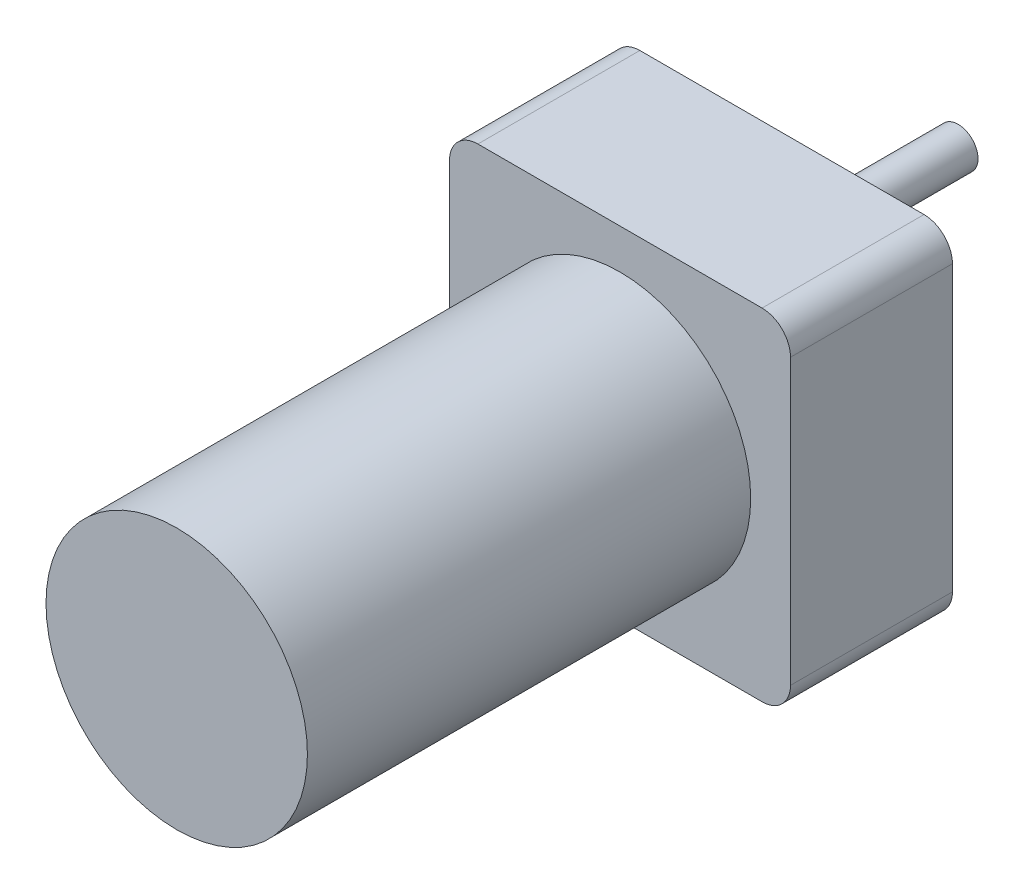
ISO-10303-21;
HEADER;
FILE_DESCRIPTION(('STEP AP214'),'2;1');
FILE_NAME('part.step','',(''),(''),'','','');
FILE_SCHEMA(('AUTOMOTIVE_DESIGN { 1 0 10303 214 1 1 1 1 }'));
ENDSEC;
DATA;
#1=APPLICATION_CONTEXT('core data for automotive mechanical design processes');
#2=APPLICATION_PROTOCOL_DEFINITION('international standard','automotive_design',2000,#1);
#3=PRODUCT_CONTEXT('',#1,'mechanical');
#4=PRODUCT('Part','Part','',(#3));
#5=PRODUCT_RELATED_PRODUCT_CATEGORY('part','',(#4));
#6=PRODUCT_DEFINITION_FORMATION('','',#4);
#7=PRODUCT_DEFINITION_CONTEXT('part definition',#1,'design');
#8=PRODUCT_DEFINITION('design','',#6,#7);
#9=PRODUCT_DEFINITION_SHAPE('','',#8);
#10=(LENGTH_UNIT() NAMED_UNIT(*) SI_UNIT(.MILLI.,.METRE.));
#11=(NAMED_UNIT(*) PLANE_ANGLE_UNIT() SI_UNIT($,.RADIAN.));
#12=(NAMED_UNIT(*) SI_UNIT($,.STERADIAN.) SOLID_ANGLE_UNIT());
#13=UNCERTAINTY_MEASURE_WITH_UNIT(LENGTH_MEASURE(1.E-05),#10,'distance_accuracy_value','');
#14=(GEOMETRIC_REPRESENTATION_CONTEXT(3) GLOBAL_UNCERTAINTY_ASSIGNED_CONTEXT((#13)) GLOBAL_UNIT_ASSIGNED_CONTEXT((#10,
#11,#12)) REPRESENTATION_CONTEXT('',''));
#15=CARTESIAN_POINT('',(0.,0.,0.));
#16=DIRECTION('',(0.,0.,1.));
#17=DIRECTION('',(1.,0.,0.));
#18=AXIS2_PLACEMENT_3D('',#15,#16,#17);
#19=CARTESIAN_POINT('',(4.99999999999998,55.,0.));
#20=DIRECTION('',(0.,0.,-1.));
#21=DIRECTION('',(-1.,0.,0.));
#22=AXIS2_PLACEMENT_3D('',#19,#20,#21);
#23=PLANE('',#22);
#24=CARTESIAN_POINT('',(4.99999999999998,55.,0.));
#25=DIRECTION('',(0.,0.,1.));
#26=DIRECTION('',(-1.,0.,0.));
#27=AXIS2_PLACEMENT_3D('',#24,#25,#26);
#28=CIRCLE('',#27,5.);
#29=CARTESIAN_POINT('',(5.00000000000002,60.,0.));
#30=VERTEX_POINT('',#29);
#31=CARTESIAN_POINT('',(0.,55.,0.));
#32=VERTEX_POINT('',#31);
#33=EDGE_CURVE('E145',#30,#32,#28,.T.);
#34=ORIENTED_EDGE('',*,*,#33,.F.);
#35=DIRECTION('',(-1.,0.,0.));
#36=VECTOR('',#35,1.);
#37=CARTESIAN_POINT('',(5.00000000000002,60.,0.));
#38=LINE('',#37,#36);
#39=CARTESIAN_POINT('',(54.9999999999999,60.,0.));
#40=VERTEX_POINT('',#39);
#41=EDGE_CURVE('E92',#40,#30,#38,.T.);
#42=ORIENTED_EDGE('',*,*,#41,.F.);
#43=CARTESIAN_POINT('',(55.,55.,0.));
#44=DIRECTION('',(0.,0.,1.));
#45=DIRECTION('',(1.,0.,0.));
#46=AXIS2_PLACEMENT_3D('',#43,#44,#45);
#47=CIRCLE('',#46,5.);
#48=CARTESIAN_POINT('',(60.,55.,0.));
#49=VERTEX_POINT('',#48);
#50=EDGE_CURVE('E158',#49,#40,#47,.T.);
#51=ORIENTED_EDGE('',*,*,#50,.F.);
#52=DIRECTION('',(0.,1.,0.));
#53=VECTOR('',#52,1.);
#54=CARTESIAN_POINT('',(60.,5.00000000000004,0.));
#55=LINE('',#54,#53);
#56=CARTESIAN_POINT('',(60.,5.,0.));
#57=VERTEX_POINT('',#56);
#58=EDGE_CURVE('E133',#57,#49,#55,.T.);
#59=ORIENTED_EDGE('',*,*,#58,.F.);
#60=CARTESIAN_POINT('',(55.,5.,0.));
#61=DIRECTION('',(0.,0.,1.));
#62=DIRECTION('',(1.,0.,0.));
#63=AXIS2_PLACEMENT_3D('',#60,#61,#62);
#64=CIRCLE('',#63,5.);
#65=CARTESIAN_POINT('',(55.,0.,0.));
#66=VERTEX_POINT('',#65);
#67=EDGE_CURVE('E155',#66,#57,#64,.T.);
#68=ORIENTED_EDGE('',*,*,#67,.F.);
#69=DIRECTION('',(1.,0.,0.));
#70=VECTOR('',#69,1.);
#71=CARTESIAN_POINT('',(5.00000000000004,0.,0.));
#72=LINE('',#71,#70);
#73=CARTESIAN_POINT('',(5.00000000000003,0.,0.));
#74=VERTEX_POINT('',#73);
#75=EDGE_CURVE('E153',#74,#66,#72,.T.);
#76=ORIENTED_EDGE('',*,*,#75,.F.);
#77=CARTESIAN_POINT('',(5.,5.,0.));
#78=DIRECTION('',(0.,0.,1.));
#79=DIRECTION('',(1.,0.,0.));
#80=AXIS2_PLACEMENT_3D('',#77,#78,#79);
#81=CIRCLE('',#80,5.);
#82=CARTESIAN_POINT('',(0.,5.00000000000003,0.));
#83=VERTEX_POINT('',#82);
#84=EDGE_CURVE('E151',#83,#74,#81,.T.);
#85=ORIENTED_EDGE('',*,*,#84,.F.);
#86=DIRECTION('',(0.,-1.,0.));
#87=VECTOR('',#86,1.);
#88=CARTESIAN_POINT('',(0.,5.00000000000003,0.));
#89=LINE('',#88,#87);
#90=EDGE_CURVE('E148',#32,#83,#89,.T.);
#91=ORIENTED_EDGE('',*,*,#90,.F.);
#92=EDGE_LOOP('',(#34,#42,#51,#59,#68,#76,#85,#91));
#93=FACE_BOUND('',#92,.T.);
#94=CARTESIAN_POINT('',(54.75,54.75,0.));
#95=DIRECTION('',(0.,0.,-1.));
#96=DIRECTION('',(-1.,0.,0.));
#97=AXIS2_PLACEMENT_3D('',#94,#95,#96);
#98=CIRCLE('',#97,2.4);
#99=CARTESIAN_POINT('',(52.35,54.75,0.));
#100=VERTEX_POINT('',#99);
#101=EDGE_CURVE('E489',#100,#100,#98,.T.);
#102=ORIENTED_EDGE('',*,*,#101,.F.);
#103=EDGE_LOOP('',(#102));
#104=FACE_BOUND('',#103,.T.);
#105=CARTESIAN_POINT('',(5.24999999999998,54.75,0.));
#106=DIRECTION('',(0.,0.,-1.));
#107=DIRECTION('',(-1.,0.,0.));
#108=AXIS2_PLACEMENT_3D('',#105,#106,#107);
#109=CIRCLE('',#108,2.4);
#110=CARTESIAN_POINT('',(2.84999999999998,54.75,0.));
#111=VERTEX_POINT('',#110);
#112=EDGE_CURVE('E508',#111,#111,#109,.T.);
#113=ORIENTED_EDGE('',*,*,#112,.F.);
#114=EDGE_LOOP('',(#113));
#115=FACE_BOUND('',#114,.T.);
#116=CARTESIAN_POINT('',(5.25,5.25,0.));
#117=DIRECTION('',(0.,0.,-1.));
#118=DIRECTION('',(-1.,0.,0.));
#119=AXIS2_PLACEMENT_3D('',#116,#117,#118);
#120=CIRCLE('',#119,2.4);
#121=CARTESIAN_POINT('',(2.85,5.25,0.));
#122=VERTEX_POINT('',#121);
#123=EDGE_CURVE('E502',#122,#122,#120,.T.);
#124=ORIENTED_EDGE('',*,*,#123,.F.);
#125=EDGE_LOOP('',(#124));
#126=FACE_BOUND('',#125,.T.);
#127=CARTESIAN_POINT('',(54.75,5.24999999999999,0.));
#128=DIRECTION('',(0.,0.,-1.));
#129=DIRECTION('',(-1.,0.,0.));
#130=AXIS2_PLACEMENT_3D('',#127,#128,#129);
#131=CIRCLE('',#130,2.4);
#132=CARTESIAN_POINT('',(52.35,5.24999999999999,0.));
#133=VERTEX_POINT('',#132);
#134=EDGE_CURVE('E495',#133,#133,#131,.T.);
#135=ORIENTED_EDGE('',*,*,#134,.F.);
#136=EDGE_LOOP('',(#135));
#137=FACE_BOUND('',#136,.T.);
#138=CARTESIAN_POINT('',(30.,40.,0.));
#139=DIRECTION('',(0.,0.,-1.));
#140=DIRECTION('',(-1.,0.,0.));
#141=AXIS2_PLACEMENT_3D('',#138,#139,#140);
#142=CIRCLE('',#141,12.5);
#143=CARTESIAN_POINT('',(17.5,40.,0.));
#144=VERTEX_POINT('',#143);
#145=EDGE_CURVE('E513',#144,#144,#142,.T.);
#146=ORIENTED_EDGE('',*,*,#145,.F.);
#147=EDGE_LOOP('',(#146));
#148=FACE_BOUND('',#147,.T.);
#149=ADVANCED_FACE('F33',(#93,#104,#115,#126,#137,#148),#23,.T.);
#150=CARTESIAN_POINT('',(4.99999999999998,55.,28.5));
#151=DIRECTION('',(0.,0.,-1.));
#152=DIRECTION('',(-1.,0.,0.));
#153=AXIS2_PLACEMENT_3D('',#150,#151,#152);
#154=CYLINDRICAL_SURFACE('',#153,5.);
#155=ORIENTED_EDGE('',*,*,#33,.T.);
#156=DIRECTION('',(0.,0.,-1.));
#157=VECTOR('',#156,1.);
#158=CARTESIAN_POINT('',(0.,55.,28.5));
#159=LINE('',#158,#157);
#160=CARTESIAN_POINT('',(0.,55.,28.5));
#161=VERTEX_POINT('',#160);
#162=EDGE_CURVE('E37',#161,#32,#159,.T.);
#163=ORIENTED_EDGE('',*,*,#162,.F.);
#164=CARTESIAN_POINT('',(4.99999999999998,55.,28.5));
#165=DIRECTION('',(0.,0.,1.));
#166=DIRECTION('',(-1.,0.,0.));
#167=AXIS2_PLACEMENT_3D('',#164,#165,#166);
#168=CIRCLE('',#167,5.);
#169=CARTESIAN_POINT('',(5.00000000000002,60.,28.5));
#170=VERTEX_POINT('',#169);
#171=EDGE_CURVE('E161',#170,#161,#168,.T.);
#172=ORIENTED_EDGE('',*,*,#171,.F.);
#173=DIRECTION('',(0.,0.,-1.));
#174=VECTOR('',#173,1.);
#175=CARTESIAN_POINT('',(5.00000000000002,60.,28.5));
#176=LINE('',#175,#174);
#177=EDGE_CURVE('E141',#170,#30,#176,.T.);
#178=ORIENTED_EDGE('',*,*,#177,.T.);
#179=EDGE_LOOP('',(#155,#163,#172,#178));
#180=FACE_BOUND('',#179,.T.);
#181=ADVANCED_FACE('F35',(#180),#154,.T.);
#182=CARTESIAN_POINT('',(0.,5.00000000000003,28.5));
#183=DIRECTION('',(1.,0.,0.));
#184=DIRECTION('',(0.,1.,0.));
#185=AXIS2_PLACEMENT_3D('',#182,#183,#184);
#186=PLANE('',#185);
#187=ORIENTED_EDGE('',*,*,#90,.T.);
#188=DIRECTION('',(0.,0.,-1.));
#189=VECTOR('',#188,1.);
#190=CARTESIAN_POINT('',(0.,5.00000000000003,28.5));
#191=LINE('',#190,#189);
#192=CARTESIAN_POINT('',(0.,5.00000000000003,28.5));
#193=VERTEX_POINT('',#192);
#194=EDGE_CURVE('E170',#193,#83,#191,.T.);
#195=ORIENTED_EDGE('',*,*,#194,.F.);
#196=DIRECTION('',(0.,-1.,0.));
#197=VECTOR('',#196,1.);
#198=CARTESIAN_POINT('',(0.,5.00000000000003,28.5));
#199=LINE('',#198,#197);
#200=EDGE_CURVE('E101',#161,#193,#199,.T.);
#201=ORIENTED_EDGE('',*,*,#200,.F.);
#202=ORIENTED_EDGE('',*,*,#162,.T.);
#203=EDGE_LOOP('',(#187,#195,#201,#202));
#204=FACE_BOUND('',#203,.T.);
#205=ADVANCED_FACE('F203',(#204),#186,.F.);
#206=CARTESIAN_POINT('',(5.,5.,28.5));
#207=DIRECTION('',(0.,0.,-1.));
#208=DIRECTION('',(-1.,0.,0.));
#209=AXIS2_PLACEMENT_3D('',#206,#207,#208);
#210=CYLINDRICAL_SURFACE('',#209,5.);
#211=ORIENTED_EDGE('',*,*,#84,.T.);
#212=DIRECTION('',(0.,0.,-1.));
#213=VECTOR('',#212,1.);
#214=CARTESIAN_POINT('',(5.00000000000003,0.,28.5));
#215=LINE('',#214,#213);
#216=CARTESIAN_POINT('',(5.00000000000003,0.,28.5));
#217=VERTEX_POINT('',#216);
#218=EDGE_CURVE('E168',#217,#74,#215,.T.);
#219=ORIENTED_EDGE('',*,*,#218,.F.);
#220=CARTESIAN_POINT('',(5.,5.,28.5));
#221=DIRECTION('',(0.,0.,1.));
#222=DIRECTION('',(1.,0.,0.));
#223=AXIS2_PLACEMENT_3D('',#220,#221,#222);
#224=CIRCLE('',#223,5.);
#225=EDGE_CURVE('E185',#193,#217,#224,.T.);
#226=ORIENTED_EDGE('',*,*,#225,.F.);
#227=ORIENTED_EDGE('',*,*,#194,.T.);
#228=EDGE_LOOP('',(#211,#219,#226,#227));
#229=FACE_BOUND('',#228,.T.);
#230=ADVANCED_FACE('F204',(#229),#210,.T.);
#231=CARTESIAN_POINT('',(5.00000000000004,0.,28.5));
#232=DIRECTION('',(0.,1.,0.));
#233=DIRECTION('',(0.,0.,1.));
#234=AXIS2_PLACEMENT_3D('',#231,#232,#233);
#235=PLANE('',#234);
#236=ORIENTED_EDGE('',*,*,#75,.T.);
#237=DIRECTION('',(0.,0.,-1.));
#238=VECTOR('',#237,1.);
#239=CARTESIAN_POINT('',(55.,0.,28.5));
#240=LINE('',#239,#238);
#241=CARTESIAN_POINT('',(55.,0.,28.5));
#242=VERTEX_POINT('',#241);
#243=EDGE_CURVE('E165',#242,#66,#240,.T.);
#244=ORIENTED_EDGE('',*,*,#243,.F.);
#245=DIRECTION('',(1.,0.,0.));
#246=VECTOR('',#245,1.);
#247=CARTESIAN_POINT('',(5.00000000000004,0.,28.5));
#248=LINE('',#247,#246);
#249=EDGE_CURVE('E187',#217,#242,#248,.T.);
#250=ORIENTED_EDGE('',*,*,#249,.F.);
#251=ORIENTED_EDGE('',*,*,#218,.T.);
#252=EDGE_LOOP('',(#236,#244,#250,#251));
#253=FACE_BOUND('',#252,.T.);
#254=ADVANCED_FACE('F192',(#253),#235,.F.);
#255=CARTESIAN_POINT('',(55.,5.,28.5));
#256=DIRECTION('',(0.,0.,-1.));
#257=DIRECTION('',(-1.,0.,0.));
#258=AXIS2_PLACEMENT_3D('',#255,#256,#257);
#259=CYLINDRICAL_SURFACE('',#258,5.);
#260=ORIENTED_EDGE('',*,*,#67,.T.);
#261=DIRECTION('',(0.,0.,-1.));
#262=VECTOR('',#261,1.);
#263=CARTESIAN_POINT('',(60.,5.,28.5));
#264=LINE('',#263,#262);
#265=CARTESIAN_POINT('',(60.,5.,28.5));
#266=VERTEX_POINT('',#265);
#267=EDGE_CURVE('E136',#266,#57,#264,.T.);
#268=ORIENTED_EDGE('',*,*,#267,.F.);
#269=CARTESIAN_POINT('',(55.,5.,28.5));
#270=DIRECTION('',(0.,0.,1.));
#271=DIRECTION('',(1.,0.,0.));
#272=AXIS2_PLACEMENT_3D('',#269,#270,#271);
#273=CIRCLE('',#272,5.);
#274=EDGE_CURVE('E124',#242,#266,#273,.T.);
#275=ORIENTED_EDGE('',*,*,#274,.F.);
#276=ORIENTED_EDGE('',*,*,#243,.T.);
#277=EDGE_LOOP('',(#260,#268,#275,#276));
#278=FACE_BOUND('',#277,.T.);
#279=ADVANCED_FACE('F196',(#278),#259,.T.);
#280=CARTESIAN_POINT('',(60.,5.00000000000004,28.5));
#281=DIRECTION('',(-1.,0.,0.));
#282=DIRECTION('',(0.,-1.,0.));
#283=AXIS2_PLACEMENT_3D('',#280,#281,#282);
#284=PLANE('',#283);
#285=ORIENTED_EDGE('',*,*,#58,.T.);
#286=DIRECTION('',(0.,0.,-1.));
#287=VECTOR('',#286,1.);
#288=CARTESIAN_POINT('',(60.,55.,28.5));
#289=LINE('',#288,#287);
#290=CARTESIAN_POINT('',(60.,55.,28.5));
#291=VERTEX_POINT('',#290);
#292=EDGE_CURVE('E130',#291,#49,#289,.T.);
#293=ORIENTED_EDGE('',*,*,#292,.F.);
#294=DIRECTION('',(0.,1.,0.));
#295=VECTOR('',#294,1.);
#296=CARTESIAN_POINT('',(60.,5.00000000000004,28.5));
#297=LINE('',#296,#295);
#298=EDGE_CURVE('E117',#266,#291,#297,.T.);
#299=ORIENTED_EDGE('',*,*,#298,.F.);
#300=ORIENTED_EDGE('',*,*,#267,.T.);
#301=EDGE_LOOP('',(#285,#293,#299,#300));
#302=FACE_BOUND('',#301,.T.);
#303=ADVANCED_FACE('F131',(#302),#284,.F.);
#304=CARTESIAN_POINT('',(55.,55.,28.5));
#305=DIRECTION('',(0.,0.,-1.));
#306=DIRECTION('',(-1.,0.,0.));
#307=AXIS2_PLACEMENT_3D('',#304,#305,#306);
#308=CYLINDRICAL_SURFACE('',#307,5.);
#309=ORIENTED_EDGE('',*,*,#50,.T.);
#310=DIRECTION('',(0.,0.,-1.));
#311=VECTOR('',#310,1.);
#312=CARTESIAN_POINT('',(54.9999999999999,60.,28.5));
#313=LINE('',#312,#311);
#314=CARTESIAN_POINT('',(54.9999999999999,60.,28.5));
#315=VERTEX_POINT('',#314);
#316=EDGE_CURVE('E137',#315,#40,#313,.T.);
#317=ORIENTED_EDGE('',*,*,#316,.F.);
#318=CARTESIAN_POINT('',(55.,55.,28.5));
#319=DIRECTION('',(0.,0.,1.));
#320=DIRECTION('',(1.,0.,0.));
#321=AXIS2_PLACEMENT_3D('',#318,#319,#320);
#322=CIRCLE('',#321,5.);
#323=EDGE_CURVE('E121',#291,#315,#322,.T.);
#324=ORIENTED_EDGE('',*,*,#323,.F.);
#325=ORIENTED_EDGE('',*,*,#292,.T.);
#326=EDGE_LOOP('',(#309,#317,#324,#325));
#327=FACE_BOUND('',#326,.T.);
#328=ADVANCED_FACE('F139',(#327),#308,.T.);
#329=CARTESIAN_POINT('',(5.00000000000002,60.,28.5));
#330=DIRECTION('',(0.,-1.,0.));
#331=DIRECTION('',(0.,0.,-1.));
#332=AXIS2_PLACEMENT_3D('',#329,#330,#331);
#333=PLANE('',#332);
#334=ORIENTED_EDGE('',*,*,#41,.T.);
#335=ORIENTED_EDGE('',*,*,#177,.F.);
#336=DIRECTION('',(-1.,0.,0.));
#337=VECTOR('',#336,1.);
#338=CARTESIAN_POINT('',(5.00000000000002,60.,28.5));
#339=LINE('',#338,#337);
#340=EDGE_CURVE('E59',#315,#170,#339,.T.);
#341=ORIENTED_EDGE('',*,*,#340,.F.);
#342=ORIENTED_EDGE('',*,*,#316,.T.);
#343=EDGE_LOOP('',(#334,#335,#341,#342));
#344=FACE_BOUND('',#343,.T.);
#345=ADVANCED_FACE('F200',(#344),#333,.F.);
#346=CARTESIAN_POINT('',(4.99999999999998,55.,28.5));
#347=DIRECTION('',(0.,0.,-1.));
#348=DIRECTION('',(-1.,0.,0.));
#349=AXIS2_PLACEMENT_3D('',#346,#347,#348);
#350=PLANE('',#349);
#351=CARTESIAN_POINT('',(30.,30.,28.5));
#352=DIRECTION('',(0.,0.,1.));
#353=DIRECTION('',(1.,0.,0.));
#354=AXIS2_PLACEMENT_3D('',#351,#352,#353);
#355=CIRCLE('',#354,23.);
#356=CARTESIAN_POINT('',(53.,30.,28.5));
#357=VERTEX_POINT('',#356);
#358=EDGE_CURVE('E42',#357,#357,#355,.T.);
#359=ORIENTED_EDGE('',*,*,#358,.F.);
#360=EDGE_LOOP('',(#359));
#361=FACE_BOUND('',#360,.T.);
#362=ORIENTED_EDGE('',*,*,#171,.T.);
#363=ORIENTED_EDGE('',*,*,#200,.T.);
#364=ORIENTED_EDGE('',*,*,#225,.T.);
#365=ORIENTED_EDGE('',*,*,#249,.T.);
#366=ORIENTED_EDGE('',*,*,#274,.T.);
#367=ORIENTED_EDGE('',*,*,#298,.T.);
#368=ORIENTED_EDGE('',*,*,#323,.T.);
#369=ORIENTED_EDGE('',*,*,#340,.T.);
#370=EDGE_LOOP('',(#362,#363,#364,#365,#366,#367,#368,#369));
#371=FACE_BOUND('',#370,.T.);
#372=ADVANCED_FACE('F119',(#361,#371),#350,.F.);
#373=CARTESIAN_POINT('',(30.,30.,106.5));
#374=DIRECTION('',(0.,0.,-1.));
#375=DIRECTION('',(-1.,0.,0.));
#376=AXIS2_PLACEMENT_3D('',#373,#374,#375);
#377=CYLINDRICAL_SURFACE('',#376,23.);
#378=CARTESIAN_POINT('',(30.,30.,106.5));
#379=DIRECTION('',(0.,0.,1.));
#380=DIRECTION('',(1.,0.,0.));
#381=AXIS2_PLACEMENT_3D('',#378,#379,#380);
#382=CIRCLE('',#381,23.);
#383=CARTESIAN_POINT('',(53.,30.,106.5));
#384=VERTEX_POINT('',#383);
#385=EDGE_CURVE('E149',#384,#384,#382,.T.);
#386=ORIENTED_EDGE('',*,*,#385,.F.);
#387=EDGE_LOOP('',(#386));
#388=FACE_BOUND('',#387,.T.);
#389=ORIENTED_EDGE('',*,*,#358,.T.);
#390=EDGE_LOOP('',(#389));
#391=FACE_BOUND('',#390,.T.);
#392=ADVANCED_FACE('F249',(#388,#391),#377,.T.);
#393=CARTESIAN_POINT('',(30.,30.,106.5));
#394=DIRECTION('',(0.,0.,1.));
#395=DIRECTION('',(1.,0.,0.));
#396=AXIS2_PLACEMENT_3D('',#393,#394,#395);
#397=PLANE('',#396);
#398=ORIENTED_EDGE('',*,*,#385,.T.);
#399=EDGE_LOOP('',(#398));
#400=FACE_BOUND('',#399,.T.);
#401=ADVANCED_FACE('F256',(#400),#397,.T.);
#402=CARTESIAN_POINT('',(54.75,54.75,10.));
#403=DIRECTION('',(0.,0.,-1.));
#404=DIRECTION('',(-1.,0.,0.));
#405=AXIS2_PLACEMENT_3D('',#402,#403,#404);
#406=CYLINDRICAL_SURFACE('',#405,2.4);
#407=CARTESIAN_POINT('',(54.75,54.75,10.));
#408=DIRECTION('',(0.,0.,-1.));
#409=DIRECTION('',(-1.,0.,0.));
#410=AXIS2_PLACEMENT_3D('',#407,#408,#409);
#411=CIRCLE('',#410,2.4);
#412=CARTESIAN_POINT('',(52.35,54.75,10.));
#413=VERTEX_POINT('',#412);
#414=EDGE_CURVE('E484',#413,#413,#411,.T.);
#415=ORIENTED_EDGE('',*,*,#414,.F.);
#416=EDGE_LOOP('',(#415));
#417=FACE_BOUND('',#416,.T.);
#418=ORIENTED_EDGE('',*,*,#101,.T.);
#419=EDGE_LOOP('',(#418));
#420=FACE_BOUND('',#419,.T.);
#421=ADVANCED_FACE('F263',(#417,#420),#406,.F.);
#422=CARTESIAN_POINT('',(54.75,54.75,10.));
#423=DIRECTION('',(0.,0.,-1.));
#424=DIRECTION('',(-1.,0.,0.));
#425=AXIS2_PLACEMENT_3D('',#422,#423,#424);
#426=PLANE('',#425);
#427=ORIENTED_EDGE('',*,*,#414,.T.);
#428=EDGE_LOOP('',(#427));
#429=FACE_BOUND('',#428,.T.);
#430=ADVANCED_FACE('F272',(#429),#426,.T.);
#431=CARTESIAN_POINT('',(5.24999999999998,54.75,10.));
#432=DIRECTION('',(0.,0.,-1.));
#433=DIRECTION('',(-1.,0.,0.));
#434=AXIS2_PLACEMENT_3D('',#431,#432,#433);
#435=CYLINDRICAL_SURFACE('',#434,2.4);
#436=CARTESIAN_POINT('',(5.24999999999998,54.75,10.));
#437=DIRECTION('',(0.,0.,-1.));
#438=DIRECTION('',(-1.,0.,0.));
#439=AXIS2_PLACEMENT_3D('',#436,#437,#438);
#440=CIRCLE('',#439,2.4);
#441=CARTESIAN_POINT('',(2.84999999999998,54.75,10.));
#442=VERTEX_POINT('',#441);
#443=EDGE_CURVE('E492',#442,#442,#440,.T.);
#444=ORIENTED_EDGE('',*,*,#443,.F.);
#445=EDGE_LOOP('',(#444));
#446=FACE_BOUND('',#445,.T.);
#447=ORIENTED_EDGE('',*,*,#112,.T.);
#448=EDGE_LOOP('',(#447));
#449=FACE_BOUND('',#448,.T.);
#450=ADVANCED_FACE('F281',(#446,#449),#435,.F.);
#451=CARTESIAN_POINT('',(5.24999999999998,54.75,10.));
#452=DIRECTION('',(0.,0.,-1.));
#453=DIRECTION('',(-1.,0.,0.));
#454=AXIS2_PLACEMENT_3D('',#451,#452,#453);
#455=PLANE('',#454);
#456=ORIENTED_EDGE('',*,*,#443,.T.);
#457=EDGE_LOOP('',(#456));
#458=FACE_BOUND('',#457,.T.);
#459=ADVANCED_FACE('F289',(#458),#455,.T.);
#460=CARTESIAN_POINT('',(5.25,5.25,10.));
#461=DIRECTION('',(0.,0.,-1.));
#462=DIRECTION('',(-1.,0.,0.));
#463=AXIS2_PLACEMENT_3D('',#460,#461,#462);
#464=CYLINDRICAL_SURFACE('',#463,2.4);
#465=CARTESIAN_POINT('',(5.25,5.25,10.));
#466=DIRECTION('',(0.,0.,-1.));
#467=DIRECTION('',(-1.,0.,0.));
#468=AXIS2_PLACEMENT_3D('',#465,#466,#467);
#469=CIRCLE('',#468,2.4);
#470=CARTESIAN_POINT('',(2.85,5.25,10.));
#471=VERTEX_POINT('',#470);
#472=EDGE_CURVE('E505',#471,#471,#469,.T.);
#473=ORIENTED_EDGE('',*,*,#472,.F.);
#474=EDGE_LOOP('',(#473));
#475=FACE_BOUND('',#474,.T.);
#476=ORIENTED_EDGE('',*,*,#123,.T.);
#477=EDGE_LOOP('',(#476));
#478=FACE_BOUND('',#477,.T.);
#479=ADVANCED_FACE('F297',(#475,#478),#464,.F.);
#480=CARTESIAN_POINT('',(5.25,5.25,10.));
#481=DIRECTION('',(0.,0.,-1.));
#482=DIRECTION('',(-1.,0.,0.));
#483=AXIS2_PLACEMENT_3D('',#480,#481,#482);
#484=PLANE('',#483);
#485=ORIENTED_EDGE('',*,*,#472,.T.);
#486=EDGE_LOOP('',(#485));
#487=FACE_BOUND('',#486,.T.);
#488=ADVANCED_FACE('F305',(#487),#484,.T.);
#489=CARTESIAN_POINT('',(54.75,5.24999999999999,10.));
#490=DIRECTION('',(0.,0.,-1.));
#491=DIRECTION('',(-1.,0.,0.));
#492=AXIS2_PLACEMENT_3D('',#489,#490,#491);
#493=CYLINDRICAL_SURFACE('',#492,2.4);
#494=CARTESIAN_POINT('',(54.75,5.24999999999999,10.));
#495=DIRECTION('',(0.,0.,-1.));
#496=DIRECTION('',(-1.,0.,0.));
#497=AXIS2_PLACEMENT_3D('',#494,#495,#496);
#498=CIRCLE('',#497,2.4);
#499=CARTESIAN_POINT('',(52.35,5.24999999999999,10.));
#500=VERTEX_POINT('',#499);
#501=EDGE_CURVE('E498',#500,#500,#498,.T.);
#502=ORIENTED_EDGE('',*,*,#501,.F.);
#503=EDGE_LOOP('',(#502));
#504=FACE_BOUND('',#503,.T.);
#505=ORIENTED_EDGE('',*,*,#134,.T.);
#506=EDGE_LOOP('',(#505));
#507=FACE_BOUND('',#506,.T.);
#508=ADVANCED_FACE('F313',(#504,#507),#493,.F.);
#509=CARTESIAN_POINT('',(54.75,5.24999999999999,10.));
#510=DIRECTION('',(0.,0.,-1.));
#511=DIRECTION('',(-1.,0.,0.));
#512=AXIS2_PLACEMENT_3D('',#509,#510,#511);
#513=PLANE('',#512);
#514=ORIENTED_EDGE('',*,*,#501,.T.);
#515=EDGE_LOOP('',(#514));
#516=FACE_BOUND('',#515,.T.);
#517=ADVANCED_FACE('F321',(#516),#513,.T.);
#518=CARTESIAN_POINT('',(30.,40.,-3.));
#519=DIRECTION('',(0.,0.,-1.));
#520=DIRECTION('',(-1.,0.,0.));
#521=AXIS2_PLACEMENT_3D('',#518,#519,#520);
#522=PLANE('',#521);
#523=CARTESIAN_POINT('',(30.,40.,-3.));
#524=DIRECTION('',(0.,0.,-1.));
#525=DIRECTION('',(-1.,0.,0.));
#526=AXIS2_PLACEMENT_3D('',#523,#524,#525);
#527=CIRCLE('',#526,12.5);
#528=CARTESIAN_POINT('',(17.5,40.,-3.));
#529=VERTEX_POINT('',#528);
#530=EDGE_CURVE('E499',#529,#529,#527,.T.);
#531=ORIENTED_EDGE('',*,*,#530,.T.);
#532=EDGE_LOOP('',(#531));
#533=FACE_BOUND('',#532,.T.);
#534=CARTESIAN_POINT('',(30.,40.,-3.));
#535=DIRECTION('',(0.,0.,-1.));
#536=DIRECTION('',(-1.,0.,0.));
#537=AXIS2_PLACEMENT_3D('',#534,#535,#536);
#538=CIRCLE('',#537,9.125);
#539=CARTESIAN_POINT('',(20.875,40.,-3.));
#540=VERTEX_POINT('',#539);
#541=EDGE_CURVE('E466',#540,#540,#538,.T.);
#542=ORIENTED_EDGE('',*,*,#541,.F.);
#543=EDGE_LOOP('',(#542));
#544=FACE_BOUND('',#543,.T.);
#545=ADVANCED_FACE('F329',(#533,#544),#522,.T.);
#546=CARTESIAN_POINT('',(30.,40.,-3.));
#547=DIRECTION('',(0.,0.,1.));
#548=DIRECTION('',(1.,0.,0.));
#549=AXIS2_PLACEMENT_3D('',#546,#547,#548);
#550=CYLINDRICAL_SURFACE('',#549,12.5);
#551=ORIENTED_EDGE('',*,*,#530,.F.);
#552=EDGE_LOOP('',(#551));
#553=FACE_BOUND('',#552,.T.);
#554=ORIENTED_EDGE('',*,*,#145,.T.);
#555=EDGE_LOOP('',(#554));
#556=FACE_BOUND('',#555,.T.);
#557=ADVANCED_FACE('F337',(#553,#556),#550,.T.);
#558=CARTESIAN_POINT('',(30.,42.25,-13.));
#559=DIRECTION('',(0.,0.,-1.));
#560=DIRECTION('',(-1.,0.,0.));
#561=AXIS2_PLACEMENT_3D('',#558,#559,#560);
#562=PLANE('',#561);
#563=CARTESIAN_POINT('',(30.,42.25,-13.));
#564=DIRECTION('',(0.,0.,-1.));
#565=DIRECTION('',(-1.,0.,0.));
#566=AXIS2_PLACEMENT_3D('',#563,#564,#565);
#567=CIRCLE('',#566,3.5);
#568=CARTESIAN_POINT('',(32.5,39.8005102572168,-13.));
#569=VERTEX_POINT('',#568);
#570=CARTESIAN_POINT('',(27.5,39.8005102572168,-13.));
#571=VERTEX_POINT('',#570);
#572=EDGE_CURVE('E483',#569,#571,#567,.T.);
#573=ORIENTED_EDGE('',*,*,#572,.T.);
#574=DIRECTION('',(1.,0.,0.));
#575=VECTOR('',#574,1.);
#576=CARTESIAN_POINT('',(32.5,39.8005102572168,-13.));
#577=LINE('',#576,#575);
#578=EDGE_CURVE('E478',#571,#569,#577,.T.);
#579=ORIENTED_EDGE('',*,*,#578,.T.);
#580=EDGE_LOOP('',(#573,#579));
#581=FACE_BOUND('',#580,.T.);
#582=ADVANCED_FACE('F345',(#581),#562,.T.);
#583=CARTESIAN_POINT('',(32.5,39.8005102572168,-13.));
#584=DIRECTION('',(0.,1.,0.));
#585=DIRECTION('',(0.,0.,1.));
#586=AXIS2_PLACEMENT_3D('',#583,#584,#585);
#587=PLANE('',#586);
#588=DIRECTION('',(1.,0.,0.));
#589=VECTOR('',#588,1.);
#590=CARTESIAN_POINT('',(32.5,39.8005102572168,-31.));
#591=LINE('',#590,#589);
#592=CARTESIAN_POINT('',(27.5,39.8005102572168,-31.));
#593=VERTEX_POINT('',#592);
#594=CARTESIAN_POINT('',(32.5,39.8005102572168,-31.));
#595=VERTEX_POINT('',#594);
#596=EDGE_CURVE('E481',#593,#595,#591,.T.);
#597=ORIENTED_EDGE('',*,*,#596,.T.);
#598=DIRECTION('',(0.,0.,-1.));
#599=VECTOR('',#598,1.);
#600=CARTESIAN_POINT('',(32.5,39.8005102572168,-13.));
#601=LINE('',#600,#599);
#602=EDGE_CURVE('E474',#569,#595,#601,.T.);
#603=ORIENTED_EDGE('',*,*,#602,.F.);
#604=ORIENTED_EDGE('',*,*,#578,.F.);
#605=DIRECTION('',(0.,0.,-1.));
#606=VECTOR('',#605,1.);
#607=CARTESIAN_POINT('',(27.5,39.8005102572168,-13.));
#608=LINE('',#607,#606);
#609=EDGE_CURVE('E50',#571,#593,#608,.T.);
#610=ORIENTED_EDGE('',*,*,#609,.T.);
#611=EDGE_LOOP('',(#597,#603,#604,#610));
#612=FACE_BOUND('',#611,.T.);
#613=ADVANCED_FACE('F353',(#612),#587,.F.);
#614=CARTESIAN_POINT('',(30.,42.25,-31.));
#615=DIRECTION('',(0.,0.,-1.));
#616=DIRECTION('',(-1.,0.,0.));
#617=AXIS2_PLACEMENT_3D('',#614,#615,#616);
#618=PLANE('',#617);
#619=ORIENTED_EDGE('',*,*,#596,.F.);
#620=CARTESIAN_POINT('',(30.,42.25,-31.));
#621=DIRECTION('',(0.,0.,-1.));
#622=DIRECTION('',(-1.,0.,0.));
#623=AXIS2_PLACEMENT_3D('',#620,#621,#622);
#624=CIRCLE('',#623,3.5);
#625=EDGE_CURVE('E471',#593,#595,#624,.T.);
#626=ORIENTED_EDGE('',*,*,#625,.T.);
#627=EDGE_LOOP('',(#619,#626));
#628=FACE_BOUND('',#627,.T.);
#629=ADVANCED_FACE('F361',(#628),#618,.T.);
#630=CARTESIAN_POINT('',(30.,42.25,-31.));
#631=DIRECTION('',(0.,0.,1.));
#632=DIRECTION('',(1.,0.,0.));
#633=AXIS2_PLACEMENT_3D('',#630,#631,#632);
#634=CYLINDRICAL_SURFACE('',#633,3.5);
#635=ORIENTED_EDGE('',*,*,#625,.F.);
#636=ORIENTED_EDGE('',*,*,#609,.F.);
#637=ORIENTED_EDGE('',*,*,#572,.F.);
#638=ORIENTED_EDGE('',*,*,#602,.T.);
#639=EDGE_LOOP('',(#635,#636,#637,#638));
#640=FACE_BOUND('',#639,.T.);
#641=CARTESIAN_POINT('',(30.,42.25,-6.));
#642=DIRECTION('',(0.,0.,-1.));
#643=DIRECTION('',(-1.,0.,0.));
#644=AXIS2_PLACEMENT_3D('',#641,#642,#643);
#645=CIRCLE('',#644,3.5);
#646=CARTESIAN_POINT('',(26.5,42.25,-6.));
#647=VERTEX_POINT('',#646);
#648=EDGE_CURVE('E11',#647,#647,#645,.T.);
#649=ORIENTED_EDGE('',*,*,#648,.T.);
#650=EDGE_LOOP('',(#649));
#651=FACE_BOUND('',#650,.T.);
#652=ADVANCED_FACE('F368',(#640,#651),#634,.T.);
#653=CARTESIAN_POINT('',(30.,40.,-6.));
#654=DIRECTION('',(0.,0.,-1.));
#655=DIRECTION('',(-1.,0.,0.));
#656=AXIS2_PLACEMENT_3D('',#653,#654,#655);
#657=PLANE('',#656);
#658=ORIENTED_EDGE('',*,*,#648,.F.);
#659=EDGE_LOOP('',(#658));
#660=FACE_BOUND('',#659,.T.);
#661=CARTESIAN_POINT('',(30.,40.,-6.));
#662=DIRECTION('',(0.,0.,-1.));
#663=DIRECTION('',(-1.,0.,0.));
#664=AXIS2_PLACEMENT_3D('',#661,#662,#663);
#665=CIRCLE('',#664,9.125);
#666=CARTESIAN_POINT('',(20.875,40.,-6.));
#667=VERTEX_POINT('',#666);
#668=EDGE_CURVE('E469',#667,#667,#665,.T.);
#669=ORIENTED_EDGE('',*,*,#668,.T.);
#670=EDGE_LOOP('',(#669));
#671=FACE_BOUND('',#670,.T.);
#672=ADVANCED_FACE('F376',(#660,#671),#657,.T.);
#673=CARTESIAN_POINT('',(30.,40.,-6.));
#674=DIRECTION('',(0.,0.,1.));
#675=DIRECTION('',(1.,0.,0.));
#676=AXIS2_PLACEMENT_3D('',#673,#674,#675);
#677=CYLINDRICAL_SURFACE('',#676,9.125);
#678=ORIENTED_EDGE('',*,*,#541,.T.);
#679=EDGE_LOOP('',(#678));
#680=FACE_BOUND('',#679,.T.);
#681=ORIENTED_EDGE('',*,*,#668,.F.);
#682=EDGE_LOOP('',(#681));
#683=FACE_BOUND('',#682,.T.);
#684=ADVANCED_FACE('F383',(#680,#683),#677,.T.);
#685=CLOSED_SHELL('',(#149,#181,#205,#230,#254,#279,#303,#328,#345,#372,#392,#401,#421,#430,
#450,#459,#479,#488,#508,#517,#545,#557,#582,#613,#629,#652,#672,#684));
#686=MANIFOLD_SOLID_BREP('B2',#685);
#687=ADVANCED_BREP_SHAPE_REPRESENTATION('',(#18,#686),#14);
#688=SHAPE_DEFINITION_REPRESENTATION(#9,#687);
ENDSEC;
END-ISO-10303-21;
